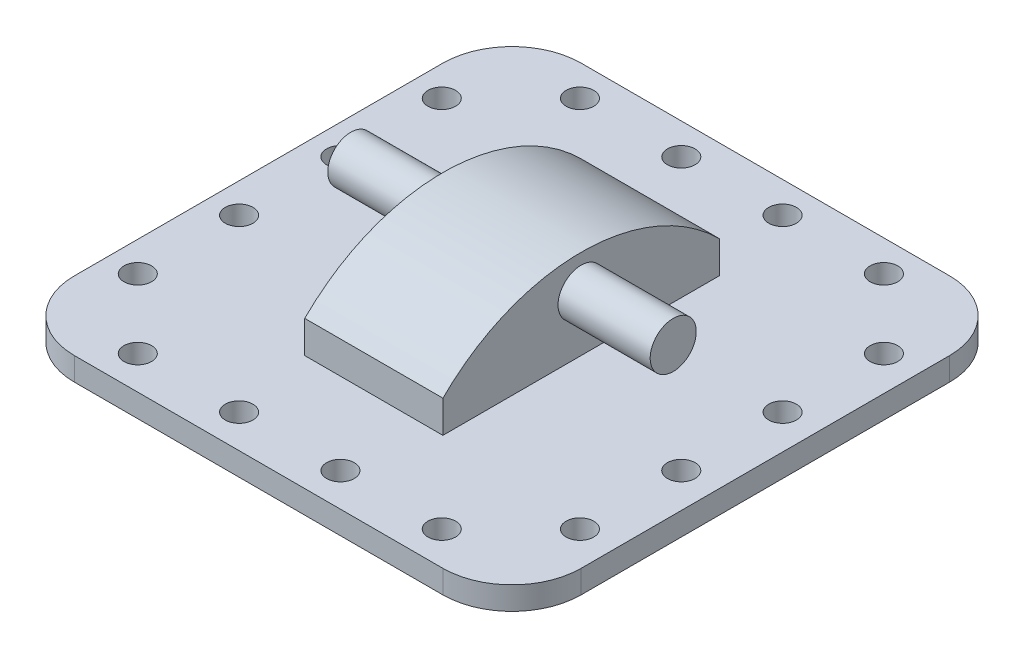
ISO-10303-21;
HEADER;
FILE_DESCRIPTION(('STEP AP214'),'2;1');
FILE_NAME('part.step','',(''),(''),'','','');
FILE_SCHEMA(('AUTOMOTIVE_DESIGN { 1 0 10303 214 1 1 1 1 }'));
ENDSEC;
DATA;
#1=APPLICATION_CONTEXT('core data for automotive mechanical design processes');
#2=APPLICATION_PROTOCOL_DEFINITION('international standard','automotive_design',2000,#1);
#3=PRODUCT_CONTEXT('',#1,'mechanical');
#4=PRODUCT('Part','Part','',(#3));
#5=PRODUCT_RELATED_PRODUCT_CATEGORY('part','',(#4));
#6=PRODUCT_DEFINITION_FORMATION('','',#4);
#7=PRODUCT_DEFINITION_CONTEXT('part definition',#1,'design');
#8=PRODUCT_DEFINITION('design','',#6,#7);
#9=PRODUCT_DEFINITION_SHAPE('','',#8);
#10=(LENGTH_UNIT() NAMED_UNIT(*) SI_UNIT(.MILLI.,.METRE.));
#11=(NAMED_UNIT(*) PLANE_ANGLE_UNIT() SI_UNIT($,.RADIAN.));
#12=(NAMED_UNIT(*) SI_UNIT($,.STERADIAN.) SOLID_ANGLE_UNIT());
#13=UNCERTAINTY_MEASURE_WITH_UNIT(LENGTH_MEASURE(1.E-05),#10,'distance_accuracy_value','');
#14=(GEOMETRIC_REPRESENTATION_CONTEXT(3) GLOBAL_UNCERTAINTY_ASSIGNED_CONTEXT((#13)) GLOBAL_UNIT_ASSIGNED_CONTEXT((#10,
#11,#12)) REPRESENTATION_CONTEXT('',''));
#15=CARTESIAN_POINT('',(0.,0.,0.));
#16=DIRECTION('',(0.,0.,1.));
#17=DIRECTION('',(1.,0.,0.));
#18=AXIS2_PLACEMENT_3D('',#15,#16,#17);
#19=CARTESIAN_POINT('',(0.,5.,0.));
#20=DIRECTION('',(0.,-1.,0.));
#21=DIRECTION('',(0.,0.,-1.));
#22=AXIS2_PLACEMENT_3D('',#19,#20,#21);
#23=PLANE('',#22);
#24=CARTESIAN_POINT('',(-48.5020444583901,5.,32.748977770805));
#25=DIRECTION('',(0.,-1.,0.));
#26=DIRECTION('',(0.,0.,-1.));
#27=AXIS2_PLACEMENT_3D('',#24,#25,#26);
#28=CIRCLE('',#27,3.);
#29=CARTESIAN_POINT('',(-48.5020444583901,5.,29.7489777708049));
#30=VERTEX_POINT('',#29);
#31=EDGE_CURVE('E314',#30,#30,#28,.T.);
#32=ORIENTED_EDGE('',*,*,#31,.T.);
#33=EDGE_LOOP('',(#32));
#34=FACE_BOUND('',#33,.T.);
#35=CARTESIAN_POINT('',(-11.5020444583901,5.,-48.2510222291951));
#36=DIRECTION('',(0.,-1.,0.));
#37=DIRECTION('',(0.,0.,-1.));
#38=AXIS2_PLACEMENT_3D('',#35,#36,#37);
#39=CIRCLE('',#38,3.00000000000002);
#40=CARTESIAN_POINT('',(-11.5020444583901,5.,-51.2510222291951));
#41=VERTEX_POINT('',#40);
#42=EDGE_CURVE('E318',#41,#41,#39,.T.);
#43=ORIENTED_EDGE('',*,*,#42,.T.);
#44=EDGE_LOOP('',(#43));
#45=FACE_BOUND('',#44,.T.);
#46=CARTESIAN_POINT('',(10.4979555416099,5.,-48.2510222291951));
#47=DIRECTION('',(0.,-1.,0.));
#48=DIRECTION('',(0.,0.,-1.));
#49=AXIS2_PLACEMENT_3D('',#46,#47,#48);
#50=CIRCLE('',#49,2.99999999999997);
#51=CARTESIAN_POINT('',(10.4979555416099,5.,-51.251022229195));
#52=VERTEX_POINT('',#51);
#53=EDGE_CURVE('E322',#52,#52,#50,.T.);
#54=ORIENTED_EDGE('',*,*,#53,.T.);
#55=EDGE_LOOP('',(#54));
#56=FACE_BOUND('',#55,.T.);
#57=CARTESIAN_POINT('',(47.4979555416099,5.,-11.251022229195));
#58=DIRECTION('',(0.,-1.,0.));
#59=DIRECTION('',(0.,0.,-1.));
#60=AXIS2_PLACEMENT_3D('',#57,#58,#59);
#61=CIRCLE('',#60,3.00000000000002);
#62=CARTESIAN_POINT('',(47.4979555416099,5.,-14.2510222291951));
#63=VERTEX_POINT('',#62);
#64=EDGE_CURVE('E326',#63,#63,#61,.T.);
#65=ORIENTED_EDGE('',*,*,#64,.T.);
#66=EDGE_LOOP('',(#65));
#67=FACE_BOUND('',#66,.T.);
#68=CARTESIAN_POINT('',(47.4979555416099,5.,32.748977770805));
#69=DIRECTION('',(0.,-1.,0.));
#70=DIRECTION('',(0.,0.,-1.));
#71=AXIS2_PLACEMENT_3D('',#68,#69,#70);
#72=CIRCLE('',#71,3.00000000000001);
#73=CARTESIAN_POINT('',(47.4979555416099,5.,29.7489777708049));
#74=VERTEX_POINT('',#73);
#75=EDGE_CURVE('E330',#74,#74,#72,.T.);
#76=ORIENTED_EDGE('',*,*,#75,.T.);
#77=EDGE_LOOP('',(#76));
#78=FACE_BOUND('',#77,.T.);
#79=CARTESIAN_POINT('',(-48.5020444583901,5.,10.7489777708049));
#80=DIRECTION('',(0.,-1.,0.));
#81=DIRECTION('',(0.,0.,-1.));
#82=AXIS2_PLACEMENT_3D('',#79,#80,#81);
#83=CIRCLE('',#82,2.99999999999997);
#84=CARTESIAN_POINT('',(-48.5020444583901,5.,7.74897777080498));
#85=VERTEX_POINT('',#84);
#86=EDGE_CURVE('E334',#85,#85,#83,.T.);
#87=ORIENTED_EDGE('',*,*,#86,.T.);
#88=EDGE_LOOP('',(#87));
#89=FACE_BOUND('',#88,.T.);
#90=CARTESIAN_POINT('',(-48.5020444583901,5.,-11.2510222291951));
#91=DIRECTION('',(0.,-1.,0.));
#92=DIRECTION('',(0.,0.,-1.));
#93=AXIS2_PLACEMENT_3D('',#90,#91,#92);
#94=CIRCLE('',#93,3.00000000000003);
#95=CARTESIAN_POINT('',(-48.5020444583901,5.,-14.2510222291951));
#96=VERTEX_POINT('',#95);
#97=EDGE_CURVE('E338',#96,#96,#94,.T.);
#98=ORIENTED_EDGE('',*,*,#97,.T.);
#99=EDGE_LOOP('',(#98));
#100=FACE_BOUND('',#99,.T.);
#101=CARTESIAN_POINT('',(-48.5020444583901,5.,-33.2510222291951));
#102=DIRECTION('',(0.,-1.,0.));
#103=DIRECTION('',(0.,0.,-1.));
#104=AXIS2_PLACEMENT_3D('',#101,#102,#103);
#105=CIRCLE('',#104,3.);
#106=CARTESIAN_POINT('',(-48.5020444583901,5.,-36.2510222291951));
#107=VERTEX_POINT('',#106);
#108=EDGE_CURVE('E342',#107,#107,#105,.T.);
#109=ORIENTED_EDGE('',*,*,#108,.T.);
#110=EDGE_LOOP('',(#109));
#111=FACE_BOUND('',#110,.T.);
#112=CARTESIAN_POINT('',(-33.5020444583901,5.,47.748977770805));
#113=DIRECTION('',(0.,-1.,0.));
#114=DIRECTION('',(0.,0.,-1.));
#115=AXIS2_PLACEMENT_3D('',#112,#113,#114);
#116=CIRCLE('',#115,3.00000000000001);
#117=CARTESIAN_POINT('',(-33.5020444583901,5.,44.7489777708049));
#118=VERTEX_POINT('',#117);
#119=EDGE_CURVE('E346',#118,#118,#116,.T.);
#120=ORIENTED_EDGE('',*,*,#119,.T.);
#121=EDGE_LOOP('',(#120));
#122=FACE_BOUND('',#121,.T.);
#123=CARTESIAN_POINT('',(-11.5020444583901,5.,47.7489777708049));
#124=DIRECTION('',(0.,-1.,0.));
#125=DIRECTION('',(0.,0.,-1.));
#126=AXIS2_PLACEMENT_3D('',#123,#124,#125);
#127=CIRCLE('',#126,3.00000000000002);
#128=CARTESIAN_POINT('',(-11.5020444583901,5.,44.7489777708049));
#129=VERTEX_POINT('',#128);
#130=EDGE_CURVE('E350',#129,#129,#127,.T.);
#131=ORIENTED_EDGE('',*,*,#130,.T.);
#132=EDGE_LOOP('',(#131));
#133=FACE_BOUND('',#132,.T.);
#134=CARTESIAN_POINT('',(10.4979555416099,5.,47.7489777708049));
#135=DIRECTION('',(0.,-1.,0.));
#136=DIRECTION('',(0.,0.,-1.));
#137=AXIS2_PLACEMENT_3D('',#134,#135,#136);
#138=CIRCLE('',#137,2.99999999999997);
#139=CARTESIAN_POINT('',(10.4979555416099,5.,44.748977770805));
#140=VERTEX_POINT('',#139);
#141=EDGE_CURVE('E354',#140,#140,#138,.T.);
#142=ORIENTED_EDGE('',*,*,#141,.T.);
#143=EDGE_LOOP('',(#142));
#144=FACE_BOUND('',#143,.T.);
#145=CARTESIAN_POINT('',(32.4979555416099,5.,47.7489777708049));
#146=DIRECTION('',(0.,-1.,0.));
#147=DIRECTION('',(0.,0.,-1.));
#148=AXIS2_PLACEMENT_3D('',#145,#146,#147);
#149=CIRCLE('',#148,3.00000000000001);
#150=CARTESIAN_POINT('',(32.4979555416099,5.,44.7489777708049));
#151=VERTEX_POINT('',#150);
#152=EDGE_CURVE('E358',#151,#151,#149,.T.);
#153=ORIENTED_EDGE('',*,*,#152,.T.);
#154=EDGE_LOOP('',(#153));
#155=FACE_BOUND('',#154,.T.);
#156=CARTESIAN_POINT('',(47.4979555416099,5.,10.7489777708049));
#157=DIRECTION('',(0.,-1.,0.));
#158=DIRECTION('',(0.,0.,-1.));
#159=AXIS2_PLACEMENT_3D('',#156,#157,#158);
#160=CIRCLE('',#159,2.99999999999997);
#161=CARTESIAN_POINT('',(47.4979555416099,5.,7.74897777080498));
#162=VERTEX_POINT('',#161);
#163=EDGE_CURVE('E362',#162,#162,#160,.T.);
#164=ORIENTED_EDGE('',*,*,#163,.T.);
#165=EDGE_LOOP('',(#164));
#166=FACE_BOUND('',#165,.T.);
#167=CARTESIAN_POINT('',(47.4979555416099,5.,-33.2510222291951));
#168=DIRECTION('',(0.,-1.,0.));
#169=DIRECTION('',(0.,0.,-1.));
#170=AXIS2_PLACEMENT_3D('',#167,#168,#169);
#171=CIRCLE('',#170,3.00000000000001);
#172=CARTESIAN_POINT('',(47.4979555416099,5.,-36.2510222291951));
#173=VERTEX_POINT('',#172);
#174=EDGE_CURVE('E366',#173,#173,#171,.T.);
#175=ORIENTED_EDGE('',*,*,#174,.T.);
#176=EDGE_LOOP('',(#175));
#177=FACE_BOUND('',#176,.T.);
#178=CARTESIAN_POINT('',(32.4979555416099,5.,-48.2510222291951));
#179=DIRECTION('',(0.,-1.,0.));
#180=DIRECTION('',(0.,0.,-1.));
#181=AXIS2_PLACEMENT_3D('',#178,#179,#180);
#182=CIRCLE('',#181,2.99999999999997);
#183=CARTESIAN_POINT('',(32.4979555416099,5.,-51.251022229195));
#184=VERTEX_POINT('',#183);
#185=EDGE_CURVE('E370',#184,#184,#182,.T.);
#186=ORIENTED_EDGE('',*,*,#185,.T.);
#187=EDGE_LOOP('',(#186));
#188=FACE_BOUND('',#187,.T.);
#189=CARTESIAN_POINT('',(-33.5020444583901,5.,-48.2510222291951));
#190=DIRECTION('',(0.,-1.,0.));
#191=DIRECTION('',(0.,0.,-1.));
#192=AXIS2_PLACEMENT_3D('',#189,#190,#191);
#193=CIRCLE('',#192,3.00000000000001);
#194=CARTESIAN_POINT('',(-33.5020444583901,5.,-51.2510222291951));
#195=VERTEX_POINT('',#194);
#196=EDGE_CURVE('E374',#195,#195,#193,.T.);
#197=ORIENTED_EDGE('',*,*,#196,.T.);
#198=EDGE_LOOP('',(#197));
#199=FACE_BOUND('',#198,.T.);
#200=DIRECTION('',(1.,0.,0.));
#201=VECTOR('',#200,1.);
#202=CARTESIAN_POINT('',(-55.,5.,55.));
#203=LINE('',#202,#201);
#204=CARTESIAN_POINT('',(-40.,5.,55.));
#205=VERTEX_POINT('',#204);
#206=CARTESIAN_POINT('',(40.,5.,55.));
#207=VERTEX_POINT('',#206);
#208=EDGE_CURVE('E177',#205,#207,#203,.T.);
#209=ORIENTED_EDGE('',*,*,#208,.T.);
#210=CARTESIAN_POINT('',(40.,5.,40.));
#211=DIRECTION('',(0.,-1.,0.));
#212=DIRECTION('',(0.,0.,-1.));
#213=AXIS2_PLACEMENT_3D('',#210,#211,#212);
#214=CIRCLE('',#213,15.);
#215=CARTESIAN_POINT('',(55.,5.,40.));
#216=VERTEX_POINT('',#215);
#217=EDGE_CURVE('E11',#207,#216,#214,.F.);
#218=ORIENTED_EDGE('',*,*,#217,.T.);
#219=DIRECTION('',(0.,0.,-1.));
#220=VECTOR('',#219,1.);
#221=CARTESIAN_POINT('',(55.,5.,55.));
#222=LINE('',#221,#220);
#223=CARTESIAN_POINT('',(55.,5.,-40.));
#224=VERTEX_POINT('',#223);
#225=EDGE_CURVE('E165',#216,#224,#222,.T.);
#226=ORIENTED_EDGE('',*,*,#225,.T.);
#227=CARTESIAN_POINT('',(40.,5.,-40.));
#228=DIRECTION('',(0.,-1.,0.));
#229=DIRECTION('',(0.,0.,-1.));
#230=AXIS2_PLACEMENT_3D('',#227,#228,#229);
#231=CIRCLE('',#230,15.);
#232=CARTESIAN_POINT('',(40.,5.,-55.));
#233=VERTEX_POINT('',#232);
#234=EDGE_CURVE('E206',#224,#233,#231,.F.);
#235=ORIENTED_EDGE('',*,*,#234,.T.);
#236=DIRECTION('',(-1.,0.,0.));
#237=VECTOR('',#236,1.);
#238=CARTESIAN_POINT('',(-55.,5.,-55.));
#239=LINE('',#238,#237);
#240=CARTESIAN_POINT('',(-40.,5.,-55.));
#241=VERTEX_POINT('',#240);
#242=EDGE_CURVE('E168',#233,#241,#239,.T.);
#243=ORIENTED_EDGE('',*,*,#242,.T.);
#244=CARTESIAN_POINT('',(-40.,5.,-40.));
#245=DIRECTION('',(0.,-1.,0.));
#246=DIRECTION('',(0.,0.,-1.));
#247=AXIS2_PLACEMENT_3D('',#244,#245,#246);
#248=CIRCLE('',#247,15.);
#249=CARTESIAN_POINT('',(-55.,5.,-40.));
#250=VERTEX_POINT('',#249);
#251=EDGE_CURVE('E220',#241,#250,#248,.F.);
#252=ORIENTED_EDGE('',*,*,#251,.T.);
#253=DIRECTION('',(0.,0.,1.));
#254=VECTOR('',#253,1.);
#255=CARTESIAN_POINT('',(-55.,5.,55.));
#256=LINE('',#255,#254);
#257=CARTESIAN_POINT('',(-55.,5.,40.));
#258=VERTEX_POINT('',#257);
#259=EDGE_CURVE('E173',#250,#258,#256,.T.);
#260=ORIENTED_EDGE('',*,*,#259,.T.);
#261=CARTESIAN_POINT('',(-40.,5.,40.));
#262=DIRECTION('',(0.,-1.,0.));
#263=DIRECTION('',(0.,0.,-1.));
#264=AXIS2_PLACEMENT_3D('',#261,#262,#263);
#265=CIRCLE('',#264,15.);
#266=EDGE_CURVE('E234',#258,#205,#265,.F.);
#267=ORIENTED_EDGE('',*,*,#266,.T.);
#268=EDGE_LOOP('',(#209,#218,#226,#235,#243,#252,#260,#267));
#269=FACE_BOUND('',#268,.T.);
#270=DIRECTION('',(0.,0.,-1.));
#271=VECTOR('',#270,1.);
#272=CARTESIAN_POINT('',(15.,5.,30.));
#273=LINE('',#272,#271);
#274=CARTESIAN_POINT('',(15.,5.,30.));
#275=VERTEX_POINT('',#274);
#276=CARTESIAN_POINT('',(15.,5.,-30.));
#277=VERTEX_POINT('',#276);
#278=EDGE_CURVE('E286',#275,#277,#273,.T.);
#279=ORIENTED_EDGE('',*,*,#278,.F.);
#280=DIRECTION('',(1.,0.,0.));
#281=VECTOR('',#280,1.);
#282=CARTESIAN_POINT('',(-15.,5.,30.));
#283=LINE('',#282,#281);
#284=CARTESIAN_POINT('',(-15.,5.,30.));
#285=VERTEX_POINT('',#284);
#286=EDGE_CURVE('E288',#285,#275,#283,.T.);
#287=ORIENTED_EDGE('',*,*,#286,.F.);
#288=DIRECTION('',(0.,0.,1.));
#289=VECTOR('',#288,1.);
#290=CARTESIAN_POINT('',(-15.,5.,30.));
#291=LINE('',#290,#289);
#292=CARTESIAN_POINT('',(-15.,5.,-30.));
#293=VERTEX_POINT('',#292);
#294=EDGE_CURVE('E295',#293,#285,#291,.T.);
#295=ORIENTED_EDGE('',*,*,#294,.F.);
#296=DIRECTION('',(-1.,0.,0.));
#297=VECTOR('',#296,1.);
#298=CARTESIAN_POINT('',(-15.,5.,-30.));
#299=LINE('',#298,#297);
#300=EDGE_CURVE('E154',#277,#293,#299,.T.);
#301=ORIENTED_EDGE('',*,*,#300,.F.);
#302=EDGE_LOOP('',(#279,#287,#295,#301));
#303=FACE_BOUND('',#302,.T.);
#304=ADVANCED_FACE('F43',(#34,#45,#56,#67,#78,#89,#100,#111,#122,#133,#144,#155,#166,#177,#188,
#199,#269,#303),#23,.F.);
#305=CARTESIAN_POINT('',(40.,5.,40.));
#306=DIRECTION('',(0.,1.,0.));
#307=DIRECTION('',(0.,0.,1.));
#308=AXIS2_PLACEMENT_3D('',#305,#306,#307);
#309=CYLINDRICAL_SURFACE('',#308,15.);
#310=DIRECTION('',(0.,1.,0.));
#311=VECTOR('',#310,1.);
#312=CARTESIAN_POINT('',(40.,5.,55.));
#313=LINE('',#312,#311);
#314=CARTESIAN_POINT('',(40.,0.,55.));
#315=VERTEX_POINT('',#314);
#316=EDGE_CURVE('E237',#315,#207,#313,.T.);
#317=ORIENTED_EDGE('',*,*,#316,.F.);
#318=CARTESIAN_POINT('',(40.,0.,40.));
#319=DIRECTION('',(0.,-1.,0.));
#320=DIRECTION('',(0.,0.,-1.));
#321=AXIS2_PLACEMENT_3D('',#318,#319,#320);
#322=CIRCLE('',#321,15.);
#323=CARTESIAN_POINT('',(55.,0.,40.));
#324=VERTEX_POINT('',#323);
#325=EDGE_CURVE('E53',#324,#315,#322,.T.);
#326=ORIENTED_EDGE('',*,*,#325,.F.);
#327=DIRECTION('',(0.,1.,0.));
#328=VECTOR('',#327,1.);
#329=CARTESIAN_POINT('',(55.,5.,40.));
#330=LINE('',#329,#328);
#331=EDGE_CURVE('E241',#216,#324,#330,.F.);
#332=ORIENTED_EDGE('',*,*,#331,.F.);
#333=ORIENTED_EDGE('',*,*,#217,.F.);
#334=EDGE_LOOP('',(#317,#326,#332,#333));
#335=FACE_BOUND('',#334,.T.);
#336=ADVANCED_FACE('F45',(#335),#309,.T.);
#337=CARTESIAN_POINT('',(-40.,5.,40.));
#338=DIRECTION('',(0.,1.,0.));
#339=DIRECTION('',(0.,0.,1.));
#340=AXIS2_PLACEMENT_3D('',#337,#338,#339);
#341=CYLINDRICAL_SURFACE('',#340,15.);
#342=DIRECTION('',(0.,1.,0.));
#343=VECTOR('',#342,1.);
#344=CARTESIAN_POINT('',(-55.,5.,40.));
#345=LINE('',#344,#343);
#346=CARTESIAN_POINT('',(-55.,0.,40.));
#347=VERTEX_POINT('',#346);
#348=EDGE_CURVE('E223',#347,#258,#345,.T.);
#349=ORIENTED_EDGE('',*,*,#348,.F.);
#350=CARTESIAN_POINT('',(-40.,0.,40.));
#351=DIRECTION('',(0.,-1.,0.));
#352=DIRECTION('',(0.,0.,-1.));
#353=AXIS2_PLACEMENT_3D('',#350,#351,#352);
#354=CIRCLE('',#353,15.);
#355=CARTESIAN_POINT('',(-40.,0.,55.));
#356=VERTEX_POINT('',#355);
#357=EDGE_CURVE('E231',#356,#347,#354,.T.);
#358=ORIENTED_EDGE('',*,*,#357,.F.);
#359=DIRECTION('',(0.,1.,0.));
#360=VECTOR('',#359,1.);
#361=CARTESIAN_POINT('',(-40.,5.,55.));
#362=LINE('',#361,#360);
#363=EDGE_CURVE('E227',#205,#356,#362,.F.);
#364=ORIENTED_EDGE('',*,*,#363,.F.);
#365=ORIENTED_EDGE('',*,*,#266,.F.);
#366=EDGE_LOOP('',(#349,#358,#364,#365));
#367=FACE_BOUND('',#366,.T.);
#368=ADVANCED_FACE('F259',(#367),#341,.T.);
#369=CARTESIAN_POINT('',(-40.,5.,-40.));
#370=DIRECTION('',(0.,1.,0.));
#371=DIRECTION('',(0.,0.,1.));
#372=AXIS2_PLACEMENT_3D('',#369,#370,#371);
#373=CYLINDRICAL_SURFACE('',#372,15.);
#374=DIRECTION('',(0.,1.,0.));
#375=VECTOR('',#374,1.);
#376=CARTESIAN_POINT('',(-40.,5.,-55.));
#377=LINE('',#376,#375);
#378=CARTESIAN_POINT('',(-40.,0.,-55.));
#379=VERTEX_POINT('',#378);
#380=EDGE_CURVE('E209',#379,#241,#377,.T.);
#381=ORIENTED_EDGE('',*,*,#380,.F.);
#382=CARTESIAN_POINT('',(-40.,0.,-40.));
#383=DIRECTION('',(0.,-1.,0.));
#384=DIRECTION('',(0.,0.,-1.));
#385=AXIS2_PLACEMENT_3D('',#382,#383,#384);
#386=CIRCLE('',#385,15.);
#387=CARTESIAN_POINT('',(-55.,0.,-40.));
#388=VERTEX_POINT('',#387);
#389=EDGE_CURVE('E217',#388,#379,#386,.T.);
#390=ORIENTED_EDGE('',*,*,#389,.F.);
#391=DIRECTION('',(0.,1.,0.));
#392=VECTOR('',#391,1.);
#393=CARTESIAN_POINT('',(-55.,5.,-40.));
#394=LINE('',#393,#392);
#395=EDGE_CURVE('E213',#250,#388,#394,.F.);
#396=ORIENTED_EDGE('',*,*,#395,.F.);
#397=ORIENTED_EDGE('',*,*,#251,.F.);
#398=EDGE_LOOP('',(#381,#390,#396,#397));
#399=FACE_BOUND('',#398,.T.);
#400=ADVANCED_FACE('F268',(#399),#373,.T.);
#401=CARTESIAN_POINT('',(40.,5.,-40.));
#402=DIRECTION('',(0.,1.,0.));
#403=DIRECTION('',(0.,0.,1.));
#404=AXIS2_PLACEMENT_3D('',#401,#402,#403);
#405=CYLINDRICAL_SURFACE('',#404,15.);
#406=DIRECTION('',(0.,1.,0.));
#407=VECTOR('',#406,1.);
#408=CARTESIAN_POINT('',(55.,5.,-40.));
#409=LINE('',#408,#407);
#410=CARTESIAN_POINT('',(55.,0.,-40.));
#411=VERTEX_POINT('',#410);
#412=EDGE_CURVE('E181',#411,#224,#409,.T.);
#413=ORIENTED_EDGE('',*,*,#412,.F.);
#414=CARTESIAN_POINT('',(40.,0.,-40.));
#415=DIRECTION('',(0.,-1.,0.));
#416=DIRECTION('',(0.,0.,-1.));
#417=AXIS2_PLACEMENT_3D('',#414,#415,#416);
#418=CIRCLE('',#417,15.);
#419=CARTESIAN_POINT('',(40.,0.,-55.));
#420=VERTEX_POINT('',#419);
#421=EDGE_CURVE('E202',#420,#411,#418,.T.);
#422=ORIENTED_EDGE('',*,*,#421,.F.);
#423=DIRECTION('',(0.,1.,0.));
#424=VECTOR('',#423,1.);
#425=CARTESIAN_POINT('',(40.,5.,-55.));
#426=LINE('',#425,#424);
#427=EDGE_CURVE('E198',#233,#420,#426,.F.);
#428=ORIENTED_EDGE('',*,*,#427,.F.);
#429=ORIENTED_EDGE('',*,*,#234,.F.);
#430=EDGE_LOOP('',(#413,#422,#428,#429));
#431=FACE_BOUND('',#430,.T.);
#432=ADVANCED_FACE('F276',(#431),#405,.T.);
#433=CARTESIAN_POINT('',(55.,5.,55.));
#434=DIRECTION('',(-1.,0.,0.));
#435=DIRECTION('',(0.,0.,1.));
#436=AXIS2_PLACEMENT_3D('',#433,#434,#435);
#437=PLANE('',#436);
#438=ORIENTED_EDGE('',*,*,#225,.F.);
#439=ORIENTED_EDGE('',*,*,#331,.T.);
#440=DIRECTION('',(0.,0.,-1.));
#441=VECTOR('',#440,1.);
#442=CARTESIAN_POINT('',(55.,0.,55.));
#443=LINE('',#442,#441);
#444=EDGE_CURVE('E160',#324,#411,#443,.T.);
#445=ORIENTED_EDGE('',*,*,#444,.T.);
#446=ORIENTED_EDGE('',*,*,#412,.T.);
#447=EDGE_LOOP('',(#438,#439,#445,#446));
#448=FACE_BOUND('',#447,.T.);
#449=ADVANCED_FACE('F279',(#448),#437,.F.);
#450=CARTESIAN_POINT('',(-55.,5.,-55.));
#451=DIRECTION('',(0.,0.,1.));
#452=DIRECTION('',(1.,0.,0.));
#453=AXIS2_PLACEMENT_3D('',#450,#451,#452);
#454=PLANE('',#453);
#455=DIRECTION('',(-1.,0.,0.));
#456=VECTOR('',#455,1.);
#457=CARTESIAN_POINT('',(-55.,0.,-55.));
#458=LINE('',#457,#456);
#459=EDGE_CURVE('E184',#420,#379,#458,.T.);
#460=ORIENTED_EDGE('',*,*,#459,.T.);
#461=ORIENTED_EDGE('',*,*,#380,.T.);
#462=ORIENTED_EDGE('',*,*,#242,.F.);
#463=ORIENTED_EDGE('',*,*,#427,.T.);
#464=EDGE_LOOP('',(#460,#461,#462,#463));
#465=FACE_BOUND('',#464,.T.);
#466=ADVANCED_FACE('F271',(#465),#454,.F.);
#467=CARTESIAN_POINT('',(-55.,5.,55.));
#468=DIRECTION('',(1.,0.,0.));
#469=DIRECTION('',(0.,0.,-1.));
#470=AXIS2_PLACEMENT_3D('',#467,#468,#469);
#471=PLANE('',#470);
#472=DIRECTION('',(0.,0.,1.));
#473=VECTOR('',#472,1.);
#474=CARTESIAN_POINT('',(-55.,0.,55.));
#475=LINE('',#474,#473);
#476=EDGE_CURVE('E188',#388,#347,#475,.T.);
#477=ORIENTED_EDGE('',*,*,#476,.T.);
#478=ORIENTED_EDGE('',*,*,#348,.T.);
#479=ORIENTED_EDGE('',*,*,#259,.F.);
#480=ORIENTED_EDGE('',*,*,#395,.T.);
#481=EDGE_LOOP('',(#477,#478,#479,#480));
#482=FACE_BOUND('',#481,.T.);
#483=ADVANCED_FACE('F264',(#482),#471,.F.);
#484=CARTESIAN_POINT('',(-55.,5.,55.));
#485=DIRECTION('',(0.,0.,-1.));
#486=DIRECTION('',(-1.,0.,0.));
#487=AXIS2_PLACEMENT_3D('',#484,#485,#486);
#488=PLANE('',#487);
#489=DIRECTION('',(1.,0.,0.));
#490=VECTOR('',#489,1.);
#491=CARTESIAN_POINT('',(-55.,0.,55.));
#492=LINE('',#491,#490);
#493=EDGE_CURVE('E169',#356,#315,#492,.T.);
#494=ORIENTED_EDGE('',*,*,#493,.T.);
#495=ORIENTED_EDGE('',*,*,#316,.T.);
#496=ORIENTED_EDGE('',*,*,#208,.F.);
#497=ORIENTED_EDGE('',*,*,#363,.T.);
#498=EDGE_LOOP('',(#494,#495,#496,#497));
#499=FACE_BOUND('',#498,.T.);
#500=ADVANCED_FACE('F255',(#499),#488,.F.);
#501=CARTESIAN_POINT('',(0.,0.,0.));
#502=DIRECTION('',(0.,-1.,0.));
#503=DIRECTION('',(0.,0.,-1.));
#504=AXIS2_PLACEMENT_3D('',#501,#502,#503);
#505=PLANE('',#504);
#506=CARTESIAN_POINT('',(-48.5020444583901,0.,32.748977770805));
#507=DIRECTION('',(0.,-1.,0.));
#508=DIRECTION('',(0.,0.,-1.));
#509=AXIS2_PLACEMENT_3D('',#506,#507,#508);
#510=CIRCLE('',#509,3.);
#511=CARTESIAN_POINT('',(-48.5020444583901,0.,29.7489777708049));
#512=VERTEX_POINT('',#511);
#513=EDGE_CURVE('E399',#512,#512,#510,.T.);
#514=ORIENTED_EDGE('',*,*,#513,.F.);
#515=EDGE_LOOP('',(#514));
#516=FACE_BOUND('',#515,.T.);
#517=CARTESIAN_POINT('',(-11.5020444583901,0.,-48.2510222291951));
#518=DIRECTION('',(0.,-1.,0.));
#519=DIRECTION('',(0.,0.,-1.));
#520=AXIS2_PLACEMENT_3D('',#517,#518,#519);
#521=CIRCLE('',#520,3.00000000000002);
#522=CARTESIAN_POINT('',(-11.5020444583901,0.,-51.2510222291951));
#523=VERTEX_POINT('',#522);
#524=EDGE_CURVE('E403',#523,#523,#521,.T.);
#525=ORIENTED_EDGE('',*,*,#524,.F.);
#526=EDGE_LOOP('',(#525));
#527=FACE_BOUND('',#526,.T.);
#528=CARTESIAN_POINT('',(10.4979555416099,0.,-48.2510222291951));
#529=DIRECTION('',(0.,-1.,0.));
#530=DIRECTION('',(0.,0.,-1.));
#531=AXIS2_PLACEMENT_3D('',#528,#529,#530);
#532=CIRCLE('',#531,2.99999999999997);
#533=CARTESIAN_POINT('',(10.4979555416099,0.,-51.251022229195));
#534=VERTEX_POINT('',#533);
#535=EDGE_CURVE('E408',#534,#534,#532,.T.);
#536=ORIENTED_EDGE('',*,*,#535,.F.);
#537=EDGE_LOOP('',(#536));
#538=FACE_BOUND('',#537,.T.);
#539=CARTESIAN_POINT('',(47.4979555416099,0.,-11.251022229195));
#540=DIRECTION('',(0.,-1.,0.));
#541=DIRECTION('',(0.,0.,-1.));
#542=AXIS2_PLACEMENT_3D('',#539,#540,#541);
#543=CIRCLE('',#542,3.00000000000002);
#544=CARTESIAN_POINT('',(47.4979555416099,0.,-14.2510222291951));
#545=VERTEX_POINT('',#544);
#546=EDGE_CURVE('E388',#545,#545,#543,.T.);
#547=ORIENTED_EDGE('',*,*,#546,.F.);
#548=EDGE_LOOP('',(#547));
#549=FACE_BOUND('',#548,.T.);
#550=CARTESIAN_POINT('',(47.4979555416099,0.,32.748977770805));
#551=DIRECTION('',(0.,-1.,0.));
#552=DIRECTION('',(0.,0.,-1.));
#553=AXIS2_PLACEMENT_3D('',#550,#551,#552);
#554=CIRCLE('',#553,3.00000000000001);
#555=CARTESIAN_POINT('',(47.4979555416099,0.,29.7489777708049));
#556=VERTEX_POINT('',#555);
#557=EDGE_CURVE('E383',#556,#556,#554,.T.);
#558=ORIENTED_EDGE('',*,*,#557,.F.);
#559=EDGE_LOOP('',(#558));
#560=FACE_BOUND('',#559,.T.);
#561=CARTESIAN_POINT('',(-48.5020444583901,0.,10.7489777708049));
#562=DIRECTION('',(0.,-1.,0.));
#563=DIRECTION('',(0.,0.,-1.));
#564=AXIS2_PLACEMENT_3D('',#561,#562,#563);
#565=CIRCLE('',#564,2.99999999999997);
#566=CARTESIAN_POINT('',(-48.5020444583901,0.,7.74897777080498));
#567=VERTEX_POINT('',#566);
#568=EDGE_CURVE('E387',#567,#567,#565,.T.);
#569=ORIENTED_EDGE('',*,*,#568,.F.);
#570=EDGE_LOOP('',(#569));
#571=FACE_BOUND('',#570,.T.);
#572=CARTESIAN_POINT('',(-48.5020444583901,0.,-11.2510222291951));
#573=DIRECTION('',(0.,-1.,0.));
#574=DIRECTION('',(0.,0.,-1.));
#575=AXIS2_PLACEMENT_3D('',#572,#573,#574);
#576=CIRCLE('',#575,3.00000000000003);
#577=CARTESIAN_POINT('',(-48.5020444583901,0.,-14.2510222291951));
#578=VERTEX_POINT('',#577);
#579=EDGE_CURVE('E392',#578,#578,#576,.T.);
#580=ORIENTED_EDGE('',*,*,#579,.F.);
#581=EDGE_LOOP('',(#580));
#582=FACE_BOUND('',#581,.T.);
#583=CARTESIAN_POINT('',(-48.5020444583901,0.,-33.2510222291951));
#584=DIRECTION('',(0.,-1.,0.));
#585=DIRECTION('',(0.,0.,-1.));
#586=AXIS2_PLACEMENT_3D('',#583,#584,#585);
#587=CIRCLE('',#586,3.);
#588=CARTESIAN_POINT('',(-48.5020444583901,0.,-36.2510222291951));
#589=VERTEX_POINT('',#588);
#590=EDGE_CURVE('E382',#589,#589,#587,.T.);
#591=ORIENTED_EDGE('',*,*,#590,.F.);
#592=EDGE_LOOP('',(#591));
#593=FACE_BOUND('',#592,.T.);
#594=CARTESIAN_POINT('',(-33.5020444583901,0.,47.748977770805));
#595=DIRECTION('',(0.,-1.,0.));
#596=DIRECTION('',(0.,0.,-1.));
#597=AXIS2_PLACEMENT_3D('',#594,#595,#596);
#598=CIRCLE('',#597,3.00000000000001);
#599=CARTESIAN_POINT('',(-33.5020444583901,0.,44.7489777708049));
#600=VERTEX_POINT('',#599);
#601=EDGE_CURVE('E404',#600,#600,#598,.T.);
#602=ORIENTED_EDGE('',*,*,#601,.F.);
#603=EDGE_LOOP('',(#602));
#604=FACE_BOUND('',#603,.T.);
#605=CARTESIAN_POINT('',(-11.5020444583901,0.,47.7489777708049));
#606=DIRECTION('',(0.,-1.,0.));
#607=DIRECTION('',(0.,0.,-1.));
#608=AXIS2_PLACEMENT_3D('',#605,#606,#607);
#609=CIRCLE('',#608,3.00000000000002);
#610=CARTESIAN_POINT('',(-11.5020444583901,0.,44.7489777708049));
#611=VERTEX_POINT('',#610);
#612=EDGE_CURVE('E435',#611,#611,#609,.T.);
#613=ORIENTED_EDGE('',*,*,#612,.F.);
#614=EDGE_LOOP('',(#613));
#615=FACE_BOUND('',#614,.T.);
#616=CARTESIAN_POINT('',(10.4979555416099,0.,47.7489777708049));
#617=DIRECTION('',(0.,-1.,0.));
#618=DIRECTION('',(0.,0.,-1.));
#619=AXIS2_PLACEMENT_3D('',#616,#617,#618);
#620=CIRCLE('',#619,2.99999999999997);
#621=CARTESIAN_POINT('',(10.4979555416099,0.,44.748977770805));
#622=VERTEX_POINT('',#621);
#623=EDGE_CURVE('E431',#622,#622,#620,.T.);
#624=ORIENTED_EDGE('',*,*,#623,.F.);
#625=EDGE_LOOP('',(#624));
#626=FACE_BOUND('',#625,.T.);
#627=CARTESIAN_POINT('',(32.4979555416099,0.,47.7489777708049));
#628=DIRECTION('',(0.,-1.,0.));
#629=DIRECTION('',(0.,0.,-1.));
#630=AXIS2_PLACEMENT_3D('',#627,#628,#629);
#631=CIRCLE('',#630,3.00000000000001);
#632=CARTESIAN_POINT('',(32.4979555416099,0.,44.7489777708049));
#633=VERTEX_POINT('',#632);
#634=EDGE_CURVE('E427',#633,#633,#631,.T.);
#635=ORIENTED_EDGE('',*,*,#634,.F.);
#636=EDGE_LOOP('',(#635));
#637=FACE_BOUND('',#636,.T.);
#638=CARTESIAN_POINT('',(47.4979555416099,0.,10.7489777708049));
#639=DIRECTION('',(0.,-1.,0.));
#640=DIRECTION('',(0.,0.,-1.));
#641=AXIS2_PLACEMENT_3D('',#638,#639,#640);
#642=CIRCLE('',#641,2.99999999999997);
#643=CARTESIAN_POINT('',(47.4979555416099,0.,7.74897777080498));
#644=VERTEX_POINT('',#643);
#645=EDGE_CURVE('E423',#644,#644,#642,.T.);
#646=ORIENTED_EDGE('',*,*,#645,.F.);
#647=EDGE_LOOP('',(#646));
#648=FACE_BOUND('',#647,.T.);
#649=CARTESIAN_POINT('',(47.4979555416099,0.,-33.2510222291951));
#650=DIRECTION('',(0.,-1.,0.));
#651=DIRECTION('',(0.,0.,-1.));
#652=AXIS2_PLACEMENT_3D('',#649,#650,#651);
#653=CIRCLE('',#652,3.00000000000001);
#654=CARTESIAN_POINT('',(47.4979555416099,0.,-36.2510222291951));
#655=VERTEX_POINT('',#654);
#656=EDGE_CURVE('E419',#655,#655,#653,.T.);
#657=ORIENTED_EDGE('',*,*,#656,.F.);
#658=EDGE_LOOP('',(#657));
#659=FACE_BOUND('',#658,.T.);
#660=CARTESIAN_POINT('',(32.4979555416099,0.,-48.2510222291951));
#661=DIRECTION('',(0.,-1.,0.));
#662=DIRECTION('',(0.,0.,-1.));
#663=AXIS2_PLACEMENT_3D('',#660,#661,#662);
#664=CIRCLE('',#663,2.99999999999997);
#665=CARTESIAN_POINT('',(32.4979555416099,0.,-51.251022229195));
#666=VERTEX_POINT('',#665);
#667=EDGE_CURVE('E415',#666,#666,#664,.T.);
#668=ORIENTED_EDGE('',*,*,#667,.F.);
#669=EDGE_LOOP('',(#668));
#670=FACE_BOUND('',#669,.T.);
#671=CARTESIAN_POINT('',(-33.5020444583901,0.,-48.2510222291951));
#672=DIRECTION('',(0.,-1.,0.));
#673=DIRECTION('',(0.,0.,-1.));
#674=AXIS2_PLACEMENT_3D('',#671,#672,#673);
#675=CIRCLE('',#674,3.00000000000001);
#676=CARTESIAN_POINT('',(-33.5020444583901,0.,-51.2510222291951));
#677=VERTEX_POINT('',#676);
#678=EDGE_CURVE('E378',#677,#677,#675,.T.);
#679=ORIENTED_EDGE('',*,*,#678,.F.);
#680=EDGE_LOOP('',(#679));
#681=FACE_BOUND('',#680,.T.);
#682=ORIENTED_EDGE('',*,*,#444,.F.);
#683=ORIENTED_EDGE('',*,*,#325,.T.);
#684=ORIENTED_EDGE('',*,*,#493,.F.);
#685=ORIENTED_EDGE('',*,*,#357,.T.);
#686=ORIENTED_EDGE('',*,*,#476,.F.);
#687=ORIENTED_EDGE('',*,*,#389,.T.);
#688=ORIENTED_EDGE('',*,*,#459,.F.);
#689=ORIENTED_EDGE('',*,*,#421,.T.);
#690=EDGE_LOOP('',(#682,#683,#684,#685,#686,#687,#688,#689));
#691=FACE_BOUND('',#690,.T.);
#692=ADVANCED_FACE('F250',(#516,#527,#538,#549,#560,#571,#582,#593,#604,#615,#626,#637,#648,
#659,#670,#681,#691),#505,.T.);
#693=CARTESIAN_POINT('',(15.,29.,30.));
#694=DIRECTION('',(-1.,0.,0.));
#695=DIRECTION('',(0.,0.,1.));
#696=AXIS2_PLACEMENT_3D('',#693,#694,#695);
#697=PLANE('',#696);
#698=CARTESIAN_POINT('',(15.,17.,0.));
#699=DIRECTION('',(-1.,0.,0.));
#700=DIRECTION('',(0.,0.,1.));
#701=AXIS2_PLACEMENT_3D('',#698,#699,#700);
#702=CIRCLE('',#701,5.);
#703=CARTESIAN_POINT('',(15.,17.,5.));
#704=VERTEX_POINT('',#703);
#705=EDGE_CURVE('E290',#704,#704,#702,.T.);
#706=ORIENTED_EDGE('',*,*,#705,.T.);
#707=EDGE_LOOP('',(#706));
#708=FACE_BOUND('',#707,.T.);
#709=DIRECTION('',(0.,-1.,0.));
#710=VECTOR('',#709,1.);
#711=CARTESIAN_POINT('',(15.,29.,-30.));
#712=LINE('',#711,#710);
#713=CARTESIAN_POINT('',(15.,12.,-30.));
#714=VERTEX_POINT('',#713);
#715=EDGE_CURVE('E156',#714,#277,#712,.T.);
#716=ORIENTED_EDGE('',*,*,#715,.F.);
#717=CARTESIAN_POINT('',(15.,-18.,0.));
#718=DIRECTION('',(-1.,0.,0.));
#719=DIRECTION('',(0.,0.,1.));
#720=AXIS2_PLACEMENT_3D('',#717,#718,#719);
#721=CIRCLE('',#720,42.4264068711929);
#722=CARTESIAN_POINT('',(15.,12.,30.));
#723=VERTEX_POINT('',#722);
#724=EDGE_CURVE('E135',#714,#723,#721,.F.);
#725=ORIENTED_EDGE('',*,*,#724,.T.);
#726=DIRECTION('',(0.,-1.,0.));
#727=VECTOR('',#726,1.);
#728=CARTESIAN_POINT('',(15.,29.,30.));
#729=LINE('',#728,#727);
#730=EDGE_CURVE('E68',#723,#275,#729,.T.);
#731=ORIENTED_EDGE('',*,*,#730,.T.);
#732=ORIENTED_EDGE('',*,*,#278,.T.);
#733=EDGE_LOOP('',(#716,#725,#731,#732));
#734=FACE_BOUND('',#733,.T.);
#735=ADVANCED_FACE('F445',(#708,#734),#697,.F.);
#736=CARTESIAN_POINT('',(-15.,29.,-30.));
#737=DIRECTION('',(0.,0.,1.));
#738=DIRECTION('',(1.,0.,0.));
#739=AXIS2_PLACEMENT_3D('',#736,#737,#738);
#740=PLANE('',#739);
#741=DIRECTION('',(0.,-1.,0.));
#742=VECTOR('',#741,1.);
#743=CARTESIAN_POINT('',(-15.,29.,-30.));
#744=LINE('',#743,#742);
#745=CARTESIAN_POINT('',(-15.,12.,-30.));
#746=VERTEX_POINT('',#745);
#747=EDGE_CURVE('E146',#746,#293,#744,.T.);
#748=ORIENTED_EDGE('',*,*,#747,.F.);
#749=DIRECTION('',(-1.,0.,0.));
#750=VECTOR('',#749,1.);
#751=CARTESIAN_POINT('',(45.,12.,-30.));
#752=LINE('',#751,#750);
#753=EDGE_CURVE('E133',#714,#746,#752,.T.);
#754=ORIENTED_EDGE('',*,*,#753,.F.);
#755=ORIENTED_EDGE('',*,*,#715,.T.);
#756=ORIENTED_EDGE('',*,*,#300,.T.);
#757=EDGE_LOOP('',(#748,#754,#755,#756));
#758=FACE_BOUND('',#757,.T.);
#759=ADVANCED_FACE('F152',(#758),#740,.F.);
#760=CARTESIAN_POINT('',(-15.,29.,30.));
#761=DIRECTION('',(1.,0.,0.));
#762=DIRECTION('',(0.,0.,-1.));
#763=AXIS2_PLACEMENT_3D('',#760,#761,#762);
#764=PLANE('',#763);
#765=CARTESIAN_POINT('',(-15.,17.,0.));
#766=DIRECTION('',(1.,0.,0.));
#767=DIRECTION('',(0.,0.,-1.));
#768=AXIS2_PLACEMENT_3D('',#765,#766,#767);
#769=CIRCLE('',#768,5.);
#770=CARTESIAN_POINT('',(-15.,17.,-5.));
#771=VERTEX_POINT('',#770);
#772=EDGE_CURVE('E47',#771,#771,#769,.T.);
#773=ORIENTED_EDGE('',*,*,#772,.T.);
#774=EDGE_LOOP('',(#773));
#775=FACE_BOUND('',#774,.T.);
#776=DIRECTION('',(0.,-1.,0.));
#777=VECTOR('',#776,1.);
#778=CARTESIAN_POINT('',(-15.,29.,30.));
#779=LINE('',#778,#777);
#780=CARTESIAN_POINT('',(-15.,12.,30.));
#781=VERTEX_POINT('',#780);
#782=EDGE_CURVE('E148',#781,#285,#779,.T.);
#783=ORIENTED_EDGE('',*,*,#782,.F.);
#784=CARTESIAN_POINT('',(-15.,-18.,0.));
#785=DIRECTION('',(1.,0.,0.));
#786=DIRECTION('',(0.,0.,-1.));
#787=AXIS2_PLACEMENT_3D('',#784,#785,#786);
#788=CIRCLE('',#787,42.4264068711929);
#789=EDGE_CURVE('E60',#746,#781,#788,.T.);
#790=ORIENTED_EDGE('',*,*,#789,.F.);
#791=ORIENTED_EDGE('',*,*,#747,.T.);
#792=ORIENTED_EDGE('',*,*,#294,.T.);
#793=EDGE_LOOP('',(#783,#790,#791,#792));
#794=FACE_BOUND('',#793,.T.);
#795=ADVANCED_FACE('F144',(#775,#794),#764,.F.);
#796=CARTESIAN_POINT('',(-15.,29.,30.));
#797=DIRECTION('',(0.,0.,-1.));
#798=DIRECTION('',(-1.,0.,0.));
#799=AXIS2_PLACEMENT_3D('',#796,#797,#798);
#800=PLANE('',#799);
#801=ORIENTED_EDGE('',*,*,#730,.F.);
#802=DIRECTION('',(-1.,0.,0.));
#803=VECTOR('',#802,1.);
#804=CARTESIAN_POINT('',(45.,12.,30.));
#805=LINE('',#804,#803);
#806=EDGE_CURVE('E140',#723,#781,#805,.T.);
#807=ORIENTED_EDGE('',*,*,#806,.T.);
#808=ORIENTED_EDGE('',*,*,#782,.T.);
#809=ORIENTED_EDGE('',*,*,#286,.T.);
#810=EDGE_LOOP('',(#801,#807,#808,#809));
#811=FACE_BOUND('',#810,.T.);
#812=ADVANCED_FACE('F293',(#811),#800,.F.);
#813=CARTESIAN_POINT('',(-35.,17.,0.));
#814=DIRECTION('',(1.,0.,0.));
#815=DIRECTION('',(0.,0.,-1.));
#816=AXIS2_PLACEMENT_3D('',#813,#814,#815);
#817=PLANE('',#816);
#818=CARTESIAN_POINT('',(-35.,17.,0.));
#819=DIRECTION('',(1.,0.,0.));
#820=DIRECTION('',(0.,0.,-1.));
#821=AXIS2_PLACEMENT_3D('',#818,#819,#820);
#822=CIRCLE('',#821,5.);
#823=CARTESIAN_POINT('',(-35.,17.,-5.));
#824=VERTEX_POINT('',#823);
#825=EDGE_CURVE('E306',#824,#824,#822,.T.);
#826=ORIENTED_EDGE('',*,*,#825,.F.);
#827=EDGE_LOOP('',(#826));
#828=FACE_BOUND('',#827,.T.);
#829=ADVANCED_FACE('F705',(#828),#817,.F.);
#830=CARTESIAN_POINT('',(-35.,17.,0.));
#831=DIRECTION('',(1.,0.,0.));
#832=DIRECTION('',(0.,0.,-1.));
#833=AXIS2_PLACEMENT_3D('',#830,#831,#832);
#834=CYLINDRICAL_SURFACE('',#833,5.);
#835=ORIENTED_EDGE('',*,*,#825,.T.);
#836=EDGE_LOOP('',(#835));
#837=FACE_BOUND('',#836,.T.);
#838=ORIENTED_EDGE('',*,*,#772,.F.);
#839=EDGE_LOOP('',(#838));
#840=FACE_BOUND('',#839,.T.);
#841=ADVANCED_FACE('F748',(#837,#840),#834,.T.);
#842=CARTESIAN_POINT('',(35.,17.,0.));
#843=DIRECTION('',(1.,0.,0.));
#844=DIRECTION('',(0.,0.,-1.));
#845=AXIS2_PLACEMENT_3D('',#842,#843,#844);
#846=CIRCLE('',#845,5.);
#847=CARTESIAN_POINT('',(35.,17.,-5.));
#848=VERTEX_POINT('',#847);
#849=EDGE_CURVE('E310',#848,#848,#846,.T.);
#850=ORIENTED_EDGE('',*,*,#849,.F.);
#851=EDGE_LOOP('',(#850));
#852=FACE_BOUND('',#851,.T.);
#853=ORIENTED_EDGE('',*,*,#705,.F.);
#854=EDGE_LOOP('',(#853));
#855=FACE_BOUND('',#854,.T.);
#856=ADVANCED_FACE('F739',(#852,#855),#834,.T.);
#857=CARTESIAN_POINT('',(35.,17.,0.));
#858=DIRECTION('',(1.,0.,0.));
#859=DIRECTION('',(0.,0.,-1.));
#860=AXIS2_PLACEMENT_3D('',#857,#858,#859);
#861=PLANE('',#860);
#862=ORIENTED_EDGE('',*,*,#849,.T.);
#863=EDGE_LOOP('',(#862));
#864=FACE_BOUND('',#863,.T.);
#865=ADVANCED_FACE('F489',(#864),#861,.T.);
#866=CARTESIAN_POINT('',(-33.5020444583901,10.,-48.2510222291951));
#867=DIRECTION('',(0.,-1.,0.));
#868=DIRECTION('',(0.,0.,-1.));
#869=AXIS2_PLACEMENT_3D('',#866,#867,#868);
#870=CYLINDRICAL_SURFACE('',#869,3.00000000000001);
#871=ORIENTED_EDGE('',*,*,#678,.T.);
#872=EDGE_LOOP('',(#871));
#873=FACE_BOUND('',#872,.T.);
#874=ORIENTED_EDGE('',*,*,#196,.F.);
#875=EDGE_LOOP('',(#874));
#876=FACE_BOUND('',#875,.T.);
#877=ADVANCED_FACE('F503',(#873,#876),#870,.F.);
#878=CARTESIAN_POINT('',(32.4979555416099,10.,-48.2510222291951));
#879=DIRECTION('',(0.,-1.,0.));
#880=DIRECTION('',(0.,0.,-1.));
#881=AXIS2_PLACEMENT_3D('',#878,#879,#880);
#882=CYLINDRICAL_SURFACE('',#881,2.99999999999997);
#883=ORIENTED_EDGE('',*,*,#667,.T.);
#884=EDGE_LOOP('',(#883));
#885=FACE_BOUND('',#884,.T.);
#886=ORIENTED_EDGE('',*,*,#185,.F.);
#887=EDGE_LOOP('',(#886));
#888=FACE_BOUND('',#887,.T.);
#889=ADVANCED_FACE('F508',(#885,#888),#882,.F.);
#890=CARTESIAN_POINT('',(47.4979555416099,10.,-33.2510222291951));
#891=DIRECTION('',(0.,-1.,0.));
#892=DIRECTION('',(0.,0.,-1.));
#893=AXIS2_PLACEMENT_3D('',#890,#891,#892);
#894=CYLINDRICAL_SURFACE('',#893,3.00000000000001);
#895=ORIENTED_EDGE('',*,*,#656,.T.);
#896=EDGE_LOOP('',(#895));
#897=FACE_BOUND('',#896,.T.);
#898=ORIENTED_EDGE('',*,*,#174,.F.);
#899=EDGE_LOOP('',(#898));
#900=FACE_BOUND('',#899,.T.);
#901=ADVANCED_FACE('F519',(#897,#900),#894,.F.);
#902=CARTESIAN_POINT('',(47.4979555416099,10.,10.7489777708049));
#903=DIRECTION('',(0.,-1.,0.));
#904=DIRECTION('',(0.,0.,-1.));
#905=AXIS2_PLACEMENT_3D('',#902,#903,#904);
#906=CYLINDRICAL_SURFACE('',#905,2.99999999999997);
#907=ORIENTED_EDGE('',*,*,#645,.T.);
#908=EDGE_LOOP('',(#907));
#909=FACE_BOUND('',#908,.T.);
#910=ORIENTED_EDGE('',*,*,#163,.F.);
#911=EDGE_LOOP('',(#910));
#912=FACE_BOUND('',#911,.T.);
#913=ADVANCED_FACE('F530',(#909,#912),#906,.F.);
#914=CARTESIAN_POINT('',(32.4979555416099,10.,47.7489777708049));
#915=DIRECTION('',(0.,-1.,0.));
#916=DIRECTION('',(0.,0.,-1.));
#917=AXIS2_PLACEMENT_3D('',#914,#915,#916);
#918=CYLINDRICAL_SURFACE('',#917,3.00000000000001);
#919=ORIENTED_EDGE('',*,*,#634,.T.);
#920=EDGE_LOOP('',(#919));
#921=FACE_BOUND('',#920,.T.);
#922=ORIENTED_EDGE('',*,*,#152,.F.);
#923=EDGE_LOOP('',(#922));
#924=FACE_BOUND('',#923,.T.);
#925=ADVANCED_FACE('F541',(#921,#924),#918,.F.);
#926=CARTESIAN_POINT('',(10.4979555416099,10.,47.7489777708049));
#927=DIRECTION('',(0.,-1.,0.));
#928=DIRECTION('',(0.,0.,-1.));
#929=AXIS2_PLACEMENT_3D('',#926,#927,#928);
#930=CYLINDRICAL_SURFACE('',#929,2.99999999999997);
#931=ORIENTED_EDGE('',*,*,#623,.T.);
#932=EDGE_LOOP('',(#931));
#933=FACE_BOUND('',#932,.T.);
#934=ORIENTED_EDGE('',*,*,#141,.F.);
#935=EDGE_LOOP('',(#934));
#936=FACE_BOUND('',#935,.T.);
#937=ADVANCED_FACE('F552',(#933,#936),#930,.F.);
#938=CARTESIAN_POINT('',(-11.5020444583901,10.,47.7489777708049));
#939=DIRECTION('',(0.,-1.,0.));
#940=DIRECTION('',(0.,0.,-1.));
#941=AXIS2_PLACEMENT_3D('',#938,#939,#940);
#942=CYLINDRICAL_SURFACE('',#941,3.00000000000002);
#943=ORIENTED_EDGE('',*,*,#612,.T.);
#944=EDGE_LOOP('',(#943));
#945=FACE_BOUND('',#944,.T.);
#946=ORIENTED_EDGE('',*,*,#130,.F.);
#947=EDGE_LOOP('',(#946));
#948=FACE_BOUND('',#947,.T.);
#949=ADVANCED_FACE('F563',(#945,#948),#942,.F.);
#950=CARTESIAN_POINT('',(-33.5020444583901,10.,47.748977770805));
#951=DIRECTION('',(0.,-1.,0.));
#952=DIRECTION('',(0.,0.,-1.));
#953=AXIS2_PLACEMENT_3D('',#950,#951,#952);
#954=CYLINDRICAL_SURFACE('',#953,3.00000000000001);
#955=ORIENTED_EDGE('',*,*,#601,.T.);
#956=EDGE_LOOP('',(#955));
#957=FACE_BOUND('',#956,.T.);
#958=ORIENTED_EDGE('',*,*,#119,.F.);
#959=EDGE_LOOP('',(#958));
#960=FACE_BOUND('',#959,.T.);
#961=ADVANCED_FACE('F574',(#957,#960),#954,.F.);
#962=CARTESIAN_POINT('',(-48.5020444583901,10.,-33.2510222291951));
#963=DIRECTION('',(0.,-1.,0.));
#964=DIRECTION('',(0.,0.,-1.));
#965=AXIS2_PLACEMENT_3D('',#962,#963,#964);
#966=CYLINDRICAL_SURFACE('',#965,3.);
#967=ORIENTED_EDGE('',*,*,#590,.T.);
#968=EDGE_LOOP('',(#967));
#969=FACE_BOUND('',#968,.T.);
#970=ORIENTED_EDGE('',*,*,#108,.F.);
#971=EDGE_LOOP('',(#970));
#972=FACE_BOUND('',#971,.T.);
#973=ADVANCED_FACE('F585',(#969,#972),#966,.F.);
#974=CARTESIAN_POINT('',(-48.5020444583901,10.,-11.2510222291951));
#975=DIRECTION('',(0.,-1.,0.));
#976=DIRECTION('',(0.,0.,-1.));
#977=AXIS2_PLACEMENT_3D('',#974,#975,#976);
#978=CYLINDRICAL_SURFACE('',#977,3.00000000000003);
#979=ORIENTED_EDGE('',*,*,#579,.T.);
#980=EDGE_LOOP('',(#979));
#981=FACE_BOUND('',#980,.T.);
#982=ORIENTED_EDGE('',*,*,#97,.F.);
#983=EDGE_LOOP('',(#982));
#984=FACE_BOUND('',#983,.T.);
#985=ADVANCED_FACE('F596',(#981,#984),#978,.F.);
#986=CARTESIAN_POINT('',(-48.5020444583901,10.,10.7489777708049));
#987=DIRECTION('',(0.,-1.,0.));
#988=DIRECTION('',(0.,0.,-1.));
#989=AXIS2_PLACEMENT_3D('',#986,#987,#988);
#990=CYLINDRICAL_SURFACE('',#989,2.99999999999997);
#991=ORIENTED_EDGE('',*,*,#568,.T.);
#992=EDGE_LOOP('',(#991));
#993=FACE_BOUND('',#992,.T.);
#994=ORIENTED_EDGE('',*,*,#86,.F.);
#995=EDGE_LOOP('',(#994));
#996=FACE_BOUND('',#995,.T.);
#997=ADVANCED_FACE('F607',(#993,#996),#990,.F.);
#998=CARTESIAN_POINT('',(47.4979555416099,10.,32.748977770805));
#999=DIRECTION('',(0.,-1.,0.));
#1000=DIRECTION('',(0.,0.,-1.));
#1001=AXIS2_PLACEMENT_3D('',#998,#999,#1000);
#1002=CYLINDRICAL_SURFACE('',#1001,3.00000000000001);
#1003=ORIENTED_EDGE('',*,*,#557,.T.);
#1004=EDGE_LOOP('',(#1003));
#1005=FACE_BOUND('',#1004,.T.);
#1006=ORIENTED_EDGE('',*,*,#75,.F.);
#1007=EDGE_LOOP('',(#1006));
#1008=FACE_BOUND('',#1007,.T.);
#1009=ADVANCED_FACE('F618',(#1005,#1008),#1002,.F.);
#1010=CARTESIAN_POINT('',(47.4979555416099,10.,-11.251022229195));
#1011=DIRECTION('',(0.,-1.,0.));
#1012=DIRECTION('',(0.,0.,-1.));
#1013=AXIS2_PLACEMENT_3D('',#1010,#1011,#1012);
#1014=CYLINDRICAL_SURFACE('',#1013,3.00000000000002);
#1015=ORIENTED_EDGE('',*,*,#546,.T.);
#1016=EDGE_LOOP('',(#1015));
#1017=FACE_BOUND('',#1016,.T.);
#1018=ORIENTED_EDGE('',*,*,#64,.F.);
#1019=EDGE_LOOP('',(#1018));
#1020=FACE_BOUND('',#1019,.T.);
#1021=ADVANCED_FACE('F629',(#1017,#1020),#1014,.F.);
#1022=CARTESIAN_POINT('',(10.4979555416099,10.,-48.2510222291951));
#1023=DIRECTION('',(0.,-1.,0.));
#1024=DIRECTION('',(0.,0.,-1.));
#1025=AXIS2_PLACEMENT_3D('',#1022,#1023,#1024);
#1026=CYLINDRICAL_SURFACE('',#1025,2.99999999999997);
#1027=ORIENTED_EDGE('',*,*,#535,.T.);
#1028=EDGE_LOOP('',(#1027));
#1029=FACE_BOUND('',#1028,.T.);
#1030=ORIENTED_EDGE('',*,*,#53,.F.);
#1031=EDGE_LOOP('',(#1030));
#1032=FACE_BOUND('',#1031,.T.);
#1033=ADVANCED_FACE('F640',(#1029,#1032),#1026,.F.);
#1034=CARTESIAN_POINT('',(-11.5020444583901,10.,-48.2510222291951));
#1035=DIRECTION('',(0.,-1.,0.));
#1036=DIRECTION('',(0.,0.,-1.));
#1037=AXIS2_PLACEMENT_3D('',#1034,#1035,#1036);
#1038=CYLINDRICAL_SURFACE('',#1037,3.00000000000002);
#1039=ORIENTED_EDGE('',*,*,#524,.T.);
#1040=EDGE_LOOP('',(#1039));
#1041=FACE_BOUND('',#1040,.T.);
#1042=ORIENTED_EDGE('',*,*,#42,.F.);
#1043=EDGE_LOOP('',(#1042));
#1044=FACE_BOUND('',#1043,.T.);
#1045=ADVANCED_FACE('F651',(#1041,#1044),#1038,.F.);
#1046=CARTESIAN_POINT('',(-48.5020444583901,10.,32.748977770805));
#1047=DIRECTION('',(0.,-1.,0.));
#1048=DIRECTION('',(0.,0.,-1.));
#1049=AXIS2_PLACEMENT_3D('',#1046,#1047,#1048);
#1050=CYLINDRICAL_SURFACE('',#1049,3.);
#1051=ORIENTED_EDGE('',*,*,#513,.T.);
#1052=EDGE_LOOP('',(#1051));
#1053=FACE_BOUND('',#1052,.T.);
#1054=ORIENTED_EDGE('',*,*,#31,.F.);
#1055=EDGE_LOOP('',(#1054));
#1056=FACE_BOUND('',#1055,.T.);
#1057=ADVANCED_FACE('F662',(#1053,#1056),#1050,.F.);
#1058=CARTESIAN_POINT('',(45.,-18.,0.));
#1059=DIRECTION('',(-1.,0.,0.));
#1060=DIRECTION('',(0.,0.,1.));
#1061=AXIS2_PLACEMENT_3D('',#1058,#1059,#1060);
#1062=CYLINDRICAL_SURFACE('',#1061,42.4264068711929);
#1063=ORIENTED_EDGE('',*,*,#753,.T.);
#1064=ORIENTED_EDGE('',*,*,#789,.T.);
#1065=ORIENTED_EDGE('',*,*,#806,.F.);
#1066=ORIENTED_EDGE('',*,*,#724,.F.);
#1067=EDGE_LOOP('',(#1063,#1064,#1065,#1066));
#1068=FACE_BOUND('',#1067,.T.);
#1069=ADVANCED_FACE('F134',(#1068),#1062,.T.);
#1070=CLOSED_SHELL('',(#304,#336,#368,#400,#432,#449,#466,#483,#500,#692,#735,#759,#795,#812,
#829,#841,#856,#865,#877,#889,#901,#913,#925,#937,#949,#961,#973,#985,#997,#1009,#1021,#1033,
#1045,#1057,#1069));
#1071=MANIFOLD_SOLID_BREP('B2',#1070);
#1072=ADVANCED_BREP_SHAPE_REPRESENTATION('',(#18,#1071),#14);
#1073=SHAPE_DEFINITION_REPRESENTATION(#9,#1072);
ENDSEC;
END-ISO-10303-21;
